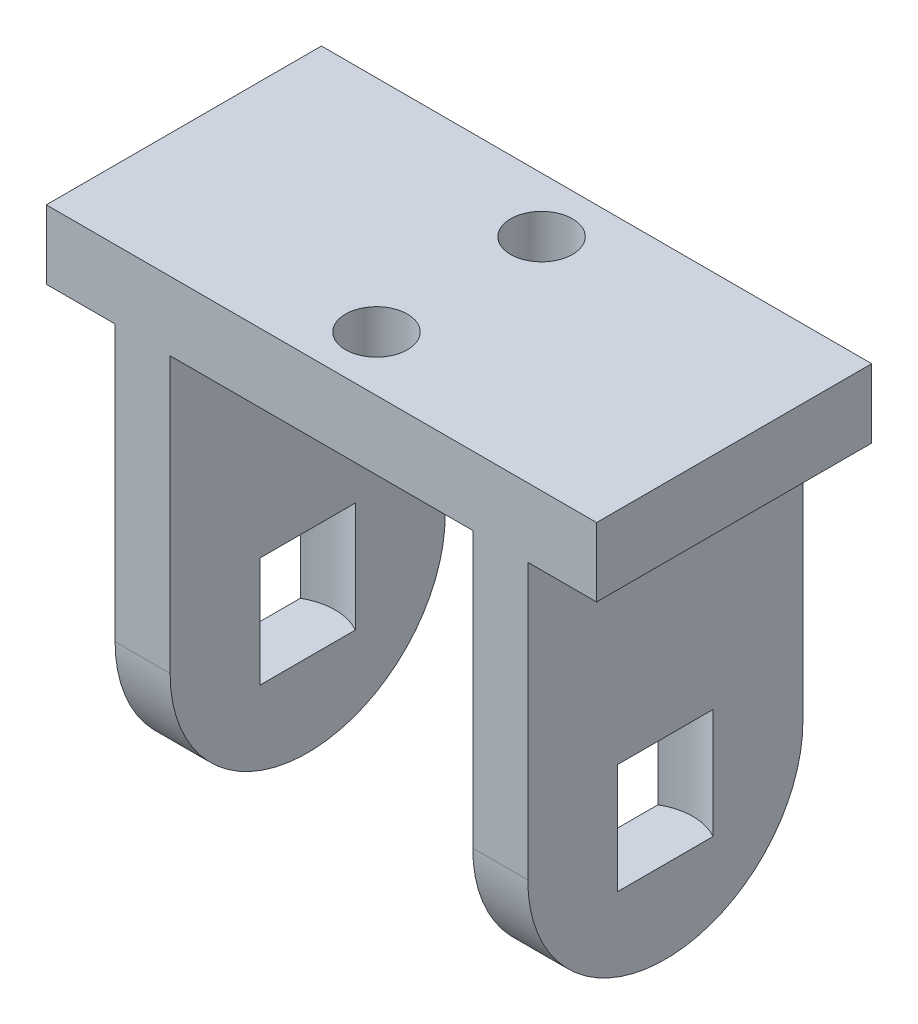
ISO-10303-21;
HEADER;
FILE_DESCRIPTION(('STEP AP214'),'2;1');
FILE_NAME('part.step','',(''),(''),'','','');
FILE_SCHEMA(('AUTOMOTIVE_DESIGN { 1 0 10303 214 1 1 1 1 }'));
ENDSEC;
DATA;
#1=APPLICATION_CONTEXT('core data for automotive mechanical design processes');
#2=APPLICATION_PROTOCOL_DEFINITION('international standard','automotive_design',2000,#1);
#3=PRODUCT_CONTEXT('',#1,'mechanical');
#4=PRODUCT('Part','Part','',(#3));
#5=PRODUCT_RELATED_PRODUCT_CATEGORY('part','',(#4));
#6=PRODUCT_DEFINITION_FORMATION('','',#4);
#7=PRODUCT_DEFINITION_CONTEXT('part definition',#1,'design');
#8=PRODUCT_DEFINITION('design','',#6,#7);
#9=PRODUCT_DEFINITION_SHAPE('','',#8);
#10=(LENGTH_UNIT() NAMED_UNIT(*) SI_UNIT(.MILLI.,.METRE.));
#11=(NAMED_UNIT(*) PLANE_ANGLE_UNIT() SI_UNIT($,.RADIAN.));
#12=(NAMED_UNIT(*) SI_UNIT($,.STERADIAN.) SOLID_ANGLE_UNIT());
#13=UNCERTAINTY_MEASURE_WITH_UNIT(LENGTH_MEASURE(1.E-05),#10,'distance_accuracy_value','');
#14=(GEOMETRIC_REPRESENTATION_CONTEXT(3) GLOBAL_UNCERTAINTY_ASSIGNED_CONTEXT((#13)) GLOBAL_UNIT_ASSIGNED_CONTEXT((#10,
#11,#12)) REPRESENTATION_CONTEXT('',''));
#15=CARTESIAN_POINT('',(0.,0.,0.));
#16=DIRECTION('',(0.,0.,1.));
#17=DIRECTION('',(1.,0.,0.));
#18=AXIS2_PLACEMENT_3D('',#15,#16,#17);
#19=CARTESIAN_POINT('',(-22.,30.,0.));
#20=DIRECTION('',(-1.,0.,0.));
#21=DIRECTION('',(0.,0.,1.));
#22=AXIS2_PLACEMENT_3D('',#19,#20,#21);
#23=PLANE('',#22);
#24=DIRECTION('',(0.,0.,1.));
#25=VECTOR('',#24,1.);
#26=CARTESIAN_POINT('',(-22.,70.,20.));
#27=LINE('',#26,#25);
#28=CARTESIAN_POINT('',(-22.,70.,-20.));
#29=VERTEX_POINT('',#28);
#30=CARTESIAN_POINT('',(-22.,70.,20.));
#31=VERTEX_POINT('',#30);
#32=EDGE_CURVE('E271',#29,#31,#27,.T.);
#33=ORIENTED_EDGE('',*,*,#32,.T.);
#34=DIRECTION('',(0.,-1.,0.));
#35=VECTOR('',#34,1.);
#36=CARTESIAN_POINT('',(-22.,30.,20.));
#37=LINE('',#36,#35);
#38=CARTESIAN_POINT('',(-22.,30.,20.));
#39=VERTEX_POINT('',#38);
#40=EDGE_CURVE('E275',#31,#39,#37,.T.);
#41=ORIENTED_EDGE('',*,*,#40,.T.);
#42=CARTESIAN_POINT('',(-22.,30.,0.));
#43=DIRECTION('',(1.,0.,0.));
#44=DIRECTION('',(0.,0.,1.));
#45=AXIS2_PLACEMENT_3D('',#42,#43,#44);
#46=CIRCLE('',#45,20.);
#47=CARTESIAN_POINT('',(-22.,30.,-20.));
#48=VERTEX_POINT('',#47);
#49=EDGE_CURVE('E279',#39,#48,#46,.T.);
#50=ORIENTED_EDGE('',*,*,#49,.T.);
#51=DIRECTION('',(0.,1.,0.));
#52=VECTOR('',#51,1.);
#53=CARTESIAN_POINT('',(-22.,70.,-20.));
#54=LINE('',#53,#52);
#55=EDGE_CURVE('E282',#48,#29,#54,.T.);
#56=ORIENTED_EDGE('',*,*,#55,.T.);
#57=EDGE_LOOP('',(#33,#41,#50,#56));
#58=FACE_BOUND('',#57,.T.);
#59=DIRECTION('',(0.,0.,-1.));
#60=VECTOR('',#59,1.);
#61=CARTESIAN_POINT('',(-22.,22.,0.));
#62=LINE('',#61,#60);
#63=CARTESIAN_POINT('',(-22.,22.,6.92820323027551));
#64=VERTEX_POINT('',#63);
#65=CARTESIAN_POINT('',(-22.,22.,-6.92820323027551));
#66=VERTEX_POINT('',#65);
#67=EDGE_CURVE('E219',#64,#66,#62,.T.);
#68=ORIENTED_EDGE('',*,*,#67,.F.);
#69=DIRECTION('',(0.,1.,0.));
#70=VECTOR('',#69,1.);
#71=CARTESIAN_POINT('',(-22.,22.,6.92820323027551));
#72=LINE('',#71,#70);
#73=CARTESIAN_POINT('',(-22.,38.,6.92820323027551));
#74=VERTEX_POINT('',#73);
#75=EDGE_CURVE('E231',#64,#74,#72,.T.);
#76=ORIENTED_EDGE('',*,*,#75,.T.);
#77=DIRECTION('',(0.,0.,-1.));
#78=VECTOR('',#77,1.);
#79=CARTESIAN_POINT('',(-22.,38.,0.));
#80=LINE('',#79,#78);
#81=CARTESIAN_POINT('',(-22.,38.,-6.92820323027551));
#82=VERTEX_POINT('',#81);
#83=EDGE_CURVE('E212',#74,#82,#80,.T.);
#84=ORIENTED_EDGE('',*,*,#83,.T.);
#85=DIRECTION('',(0.,1.,0.));
#86=VECTOR('',#85,1.);
#87=CARTESIAN_POINT('',(-22.,22.,-6.92820323027551));
#88=LINE('',#87,#86);
#89=EDGE_CURVE('E227',#82,#66,#88,.F.);
#90=ORIENTED_EDGE('',*,*,#89,.T.);
#91=EDGE_LOOP('',(#68,#76,#84,#90));
#92=FACE_BOUND('',#91,.T.);
#93=ADVANCED_FACE('F45',(#58,#92),#23,.F.);
#94=CARTESIAN_POINT('',(-30.,30.,0.));
#95=DIRECTION('',(-1.,0.,0.));
#96=DIRECTION('',(0.,0.,1.));
#97=AXIS2_PLACEMENT_3D('',#94,#95,#96);
#98=PLANE('',#97);
#99=DIRECTION('',(0.,0.,1.));
#100=VECTOR('',#99,1.);
#101=CARTESIAN_POINT('',(-30.,70.,20.));
#102=LINE('',#101,#100);
#103=CARTESIAN_POINT('',(-30.,70.,-20.));
#104=VERTEX_POINT('',#103);
#105=CARTESIAN_POINT('',(-30.,70.,20.));
#106=VERTEX_POINT('',#105);
#107=EDGE_CURVE('E270',#104,#106,#102,.T.);
#108=ORIENTED_EDGE('',*,*,#107,.F.);
#109=DIRECTION('',(0.,1.,0.));
#110=VECTOR('',#109,1.);
#111=CARTESIAN_POINT('',(-30.,70.,-20.));
#112=LINE('',#111,#110);
#113=CARTESIAN_POINT('',(-30.,30.,-20.));
#114=VERTEX_POINT('',#113);
#115=EDGE_CURVE('E276',#114,#104,#112,.T.);
#116=ORIENTED_EDGE('',*,*,#115,.F.);
#117=CARTESIAN_POINT('',(-30.,30.,0.));
#118=DIRECTION('',(1.,0.,0.));
#119=DIRECTION('',(0.,0.,1.));
#120=AXIS2_PLACEMENT_3D('',#117,#118,#119);
#121=CIRCLE('',#120,20.);
#122=CARTESIAN_POINT('',(-30.,30.,20.));
#123=VERTEX_POINT('',#122);
#124=EDGE_CURVE('E292',#123,#114,#121,.T.);
#125=ORIENTED_EDGE('',*,*,#124,.F.);
#126=DIRECTION('',(0.,-1.,0.));
#127=VECTOR('',#126,1.);
#128=CARTESIAN_POINT('',(-30.,30.,20.));
#129=LINE('',#128,#127);
#130=EDGE_CURVE('E289',#106,#123,#129,.T.);
#131=ORIENTED_EDGE('',*,*,#130,.F.);
#132=EDGE_LOOP('',(#108,#116,#125,#131));
#133=FACE_BOUND('',#132,.T.);
#134=DIRECTION('',(0.,1.,0.));
#135=VECTOR('',#134,1.);
#136=CARTESIAN_POINT('',(-30.,22.,6.92820323027551));
#137=LINE('',#136,#135);
#138=CARTESIAN_POINT('',(-30.,22.,6.92820323027551));
#139=VERTEX_POINT('',#138);
#140=CARTESIAN_POINT('',(-30.,38.,6.92820323027551));
#141=VERTEX_POINT('',#140);
#142=EDGE_CURVE('E55',#139,#141,#137,.T.);
#143=ORIENTED_EDGE('',*,*,#142,.F.);
#144=DIRECTION('',(0.,0.,-1.));
#145=VECTOR('',#144,1.);
#146=CARTESIAN_POINT('',(-30.,22.,0.));
#147=LINE('',#146,#145);
#148=CARTESIAN_POINT('',(-30.,22.,-6.92820323027551));
#149=VERTEX_POINT('',#148);
#150=EDGE_CURVE('E11',#139,#149,#147,.T.);
#151=ORIENTED_EDGE('',*,*,#150,.T.);
#152=DIRECTION('',(0.,1.,0.));
#153=VECTOR('',#152,1.);
#154=CARTESIAN_POINT('',(-30.,22.,-6.92820323027551));
#155=LINE('',#154,#153);
#156=CARTESIAN_POINT('',(-30.,38.,-6.92820323027551));
#157=VERTEX_POINT('',#156);
#158=EDGE_CURVE('E368',#157,#149,#155,.F.);
#159=ORIENTED_EDGE('',*,*,#158,.F.);
#160=DIRECTION('',(0.,0.,-1.));
#161=VECTOR('',#160,1.);
#162=CARTESIAN_POINT('',(-30.,38.,0.));
#163=LINE('',#162,#161);
#164=EDGE_CURVE('E365',#141,#157,#163,.T.);
#165=ORIENTED_EDGE('',*,*,#164,.F.);
#166=EDGE_LOOP('',(#143,#151,#159,#165));
#167=FACE_BOUND('',#166,.T.);
#168=ADVANCED_FACE('F466',(#133,#167),#98,.T.);
#169=CARTESIAN_POINT('',(30.,30.,0.));
#170=DIRECTION('',(-1.,0.,0.));
#171=DIRECTION('',(0.,0.,1.));
#172=AXIS2_PLACEMENT_3D('',#169,#170,#171);
#173=PLANE('',#172);
#174=DIRECTION('',(0.,0.,1.));
#175=VECTOR('',#174,1.);
#176=CARTESIAN_POINT('',(30.,70.,20.));
#177=LINE('',#176,#175);
#178=CARTESIAN_POINT('',(30.,70.,-20.));
#179=VERTEX_POINT('',#178);
#180=CARTESIAN_POINT('',(30.,70.,20.));
#181=VERTEX_POINT('',#180);
#182=EDGE_CURVE('E236',#179,#181,#177,.T.);
#183=ORIENTED_EDGE('',*,*,#182,.T.);
#184=DIRECTION('',(0.,-1.,0.));
#185=VECTOR('',#184,1.);
#186=CARTESIAN_POINT('',(30.,30.,20.));
#187=LINE('',#186,#185);
#188=CARTESIAN_POINT('',(30.,30.,20.));
#189=VERTEX_POINT('',#188);
#190=EDGE_CURVE('E240',#181,#189,#187,.T.);
#191=ORIENTED_EDGE('',*,*,#190,.T.);
#192=CARTESIAN_POINT('',(30.,30.,0.));
#193=DIRECTION('',(1.,0.,0.));
#194=DIRECTION('',(0.,0.,1.));
#195=AXIS2_PLACEMENT_3D('',#192,#193,#194);
#196=CIRCLE('',#195,20.);
#197=CARTESIAN_POINT('',(30.,30.,-20.));
#198=VERTEX_POINT('',#197);
#199=EDGE_CURVE('E244',#189,#198,#196,.T.);
#200=ORIENTED_EDGE('',*,*,#199,.T.);
#201=DIRECTION('',(0.,1.,0.));
#202=VECTOR('',#201,1.);
#203=CARTESIAN_POINT('',(30.,70.,-20.));
#204=LINE('',#203,#202);
#205=EDGE_CURVE('E247',#198,#179,#204,.T.);
#206=ORIENTED_EDGE('',*,*,#205,.T.);
#207=EDGE_LOOP('',(#183,#191,#200,#206));
#208=FACE_BOUND('',#207,.T.);
#209=DIRECTION('',(0.,0.,-1.));
#210=VECTOR('',#209,1.);
#211=CARTESIAN_POINT('',(30.,22.,0.));
#212=LINE('',#211,#210);
#213=CARTESIAN_POINT('',(30.,22.,6.92820323027551));
#214=VERTEX_POINT('',#213);
#215=CARTESIAN_POINT('',(30.,22.,-6.92820323027551));
#216=VERTEX_POINT('',#215);
#217=EDGE_CURVE('E195',#214,#216,#212,.T.);
#218=ORIENTED_EDGE('',*,*,#217,.F.);
#219=DIRECTION('',(0.,1.,0.));
#220=VECTOR('',#219,1.);
#221=CARTESIAN_POINT('',(30.,22.,6.92820323027551));
#222=LINE('',#221,#220);
#223=CARTESIAN_POINT('',(30.,38.,6.92820323027551));
#224=VERTEX_POINT('',#223);
#225=EDGE_CURVE('E201',#214,#224,#222,.T.);
#226=ORIENTED_EDGE('',*,*,#225,.T.);
#227=DIRECTION('',(0.,0.,-1.));
#228=VECTOR('',#227,1.);
#229=CARTESIAN_POINT('',(30.,38.,0.));
#230=LINE('',#229,#228);
#231=CARTESIAN_POINT('',(30.,38.,-6.92820323027551));
#232=VERTEX_POINT('',#231);
#233=EDGE_CURVE('E183',#224,#232,#230,.T.);
#234=ORIENTED_EDGE('',*,*,#233,.T.);
#235=DIRECTION('',(0.,1.,0.));
#236=VECTOR('',#235,1.);
#237=CARTESIAN_POINT('',(30.,22.,-6.92820323027551));
#238=LINE('',#237,#236);
#239=EDGE_CURVE('E213',#232,#216,#238,.F.);
#240=ORIENTED_EDGE('',*,*,#239,.T.);
#241=EDGE_LOOP('',(#218,#226,#234,#240));
#242=FACE_BOUND('',#241,.T.);
#243=ADVANCED_FACE('F210',(#208,#242),#173,.F.);
#244=CARTESIAN_POINT('',(22.,30.,0.));
#245=DIRECTION('',(-1.,0.,0.));
#246=DIRECTION('',(0.,0.,1.));
#247=AXIS2_PLACEMENT_3D('',#244,#245,#246);
#248=PLANE('',#247);
#249=DIRECTION('',(0.,0.,1.));
#250=VECTOR('',#249,1.);
#251=CARTESIAN_POINT('',(22.,70.,20.));
#252=LINE('',#251,#250);
#253=CARTESIAN_POINT('',(22.,70.,-20.));
#254=VERTEX_POINT('',#253);
#255=CARTESIAN_POINT('',(22.,70.,20.));
#256=VERTEX_POINT('',#255);
#257=EDGE_CURVE('E235',#254,#256,#252,.T.);
#258=ORIENTED_EDGE('',*,*,#257,.F.);
#259=DIRECTION('',(0.,1.,0.));
#260=VECTOR('',#259,1.);
#261=CARTESIAN_POINT('',(22.,70.,-20.));
#262=LINE('',#261,#260);
#263=CARTESIAN_POINT('',(22.,30.,-20.));
#264=VERTEX_POINT('',#263);
#265=EDGE_CURVE('E241',#264,#254,#262,.T.);
#266=ORIENTED_EDGE('',*,*,#265,.F.);
#267=CARTESIAN_POINT('',(22.,30.,0.));
#268=DIRECTION('',(1.,0.,0.));
#269=DIRECTION('',(0.,0.,1.));
#270=AXIS2_PLACEMENT_3D('',#267,#268,#269);
#271=CIRCLE('',#270,20.);
#272=CARTESIAN_POINT('',(22.,30.,20.));
#273=VERTEX_POINT('',#272);
#274=EDGE_CURVE('E257',#273,#264,#271,.T.);
#275=ORIENTED_EDGE('',*,*,#274,.F.);
#276=DIRECTION('',(0.,-1.,0.));
#277=VECTOR('',#276,1.);
#278=CARTESIAN_POINT('',(22.,30.,20.));
#279=LINE('',#278,#277);
#280=EDGE_CURVE('E254',#256,#273,#279,.T.);
#281=ORIENTED_EDGE('',*,*,#280,.F.);
#282=EDGE_LOOP('',(#258,#266,#275,#281));
#283=FACE_BOUND('',#282,.T.);
#284=DIRECTION('',(0.,1.,0.));
#285=VECTOR('',#284,1.);
#286=CARTESIAN_POINT('',(22.,22.,6.92820323027551));
#287=LINE('',#286,#285);
#288=CARTESIAN_POINT('',(22.,22.,6.92820323027551));
#289=VERTEX_POINT('',#288);
#290=CARTESIAN_POINT('',(22.,38.,6.92820323027551));
#291=VERTEX_POINT('',#290);
#292=EDGE_CURVE('E204',#289,#291,#287,.T.);
#293=ORIENTED_EDGE('',*,*,#292,.F.);
#294=DIRECTION('',(0.,0.,-1.));
#295=VECTOR('',#294,1.);
#296=CARTESIAN_POINT('',(22.,22.,0.));
#297=LINE('',#296,#295);
#298=CARTESIAN_POINT('',(22.,22.,-6.92820323027551));
#299=VERTEX_POINT('',#298);
#300=EDGE_CURVE('E361',#289,#299,#297,.T.);
#301=ORIENTED_EDGE('',*,*,#300,.T.);
#302=DIRECTION('',(0.,1.,0.));
#303=VECTOR('',#302,1.);
#304=CARTESIAN_POINT('',(22.,22.,-6.92820323027551));
#305=LINE('',#304,#303);
#306=CARTESIAN_POINT('',(22.,38.,-6.92820323027551));
#307=VERTEX_POINT('',#306);
#308=EDGE_CURVE('E356',#307,#299,#305,.F.);
#309=ORIENTED_EDGE('',*,*,#308,.F.);
#310=DIRECTION('',(0.,0.,-1.));
#311=VECTOR('',#310,1.);
#312=CARTESIAN_POINT('',(22.,38.,0.));
#313=LINE('',#312,#311);
#314=EDGE_CURVE('E353',#291,#307,#313,.T.);
#315=ORIENTED_EDGE('',*,*,#314,.F.);
#316=EDGE_LOOP('',(#293,#301,#309,#315));
#317=FACE_BOUND('',#316,.T.);
#318=ADVANCED_FACE('F450',(#283,#317),#248,.T.);
#319=CARTESIAN_POINT('',(0.,70.,0.));
#320=DIRECTION('',(0.,-1.,0.));
#321=DIRECTION('',(0.,0.,-1.));
#322=AXIS2_PLACEMENT_3D('',#319,#320,#321);
#323=PLANE('',#322);
#324=DIRECTION('',(1.,0.,0.));
#325=VECTOR('',#324,1.);
#326=CARTESIAN_POINT('',(40.,70.,20.));
#327=LINE('',#326,#325);
#328=CARTESIAN_POINT('',(40.,70.,20.));
#329=VERTEX_POINT('',#328);
#330=EDGE_CURVE('E324',#181,#329,#327,.T.);
#331=ORIENTED_EDGE('',*,*,#330,.F.);
#332=ORIENTED_EDGE('',*,*,#182,.F.);
#333=DIRECTION('',(-1.,0.,0.));
#334=VECTOR('',#333,1.);
#335=CARTESIAN_POINT('',(-40.,70.,-20.));
#336=LINE('',#335,#334);
#337=CARTESIAN_POINT('',(40.,70.,-20.));
#338=VERTEX_POINT('',#337);
#339=EDGE_CURVE('E311',#338,#179,#336,.T.);
#340=ORIENTED_EDGE('',*,*,#339,.F.);
#341=DIRECTION('',(0.,0.,-1.));
#342=VECTOR('',#341,1.);
#343=CARTESIAN_POINT('',(40.,70.,-20.));
#344=LINE('',#343,#342);
#345=EDGE_CURVE('E329',#329,#338,#344,.T.);
#346=ORIENTED_EDGE('',*,*,#345,.F.);
#347=EDGE_LOOP('',(#331,#332,#340,#346));
#348=FACE_BOUND('',#347,.T.);
#349=ADVANCED_FACE('F439',(#348),#323,.T.);
#350=CARTESIAN_POINT('',(-40.,70.,-20.));
#351=VERTEX_POINT('',#350);
#352=EDGE_CURVE('E333',#104,#351,#336,.T.);
#353=ORIENTED_EDGE('',*,*,#352,.F.);
#354=ORIENTED_EDGE('',*,*,#107,.T.);
#355=CARTESIAN_POINT('',(-40.,70.,20.));
#356=VERTEX_POINT('',#355);
#357=EDGE_CURVE('E325',#356,#106,#327,.T.);
#358=ORIENTED_EDGE('',*,*,#357,.F.);
#359=DIRECTION('',(0.,0.,1.));
#360=VECTOR('',#359,1.);
#361=CARTESIAN_POINT('',(-40.,70.,20.));
#362=LINE('',#361,#360);
#363=EDGE_CURVE('E305',#351,#356,#362,.T.);
#364=ORIENTED_EDGE('',*,*,#363,.F.);
#365=EDGE_LOOP('',(#353,#354,#358,#364));
#366=FACE_BOUND('',#365,.T.);
#367=ADVANCED_FACE('F425',(#366),#323,.T.);
#368=CARTESIAN_POINT('',(-40.,80.,20.));
#369=DIRECTION('',(1.,0.,0.));
#370=DIRECTION('',(0.,0.,-1.));
#371=AXIS2_PLACEMENT_3D('',#368,#369,#370);
#372=PLANE('',#371);
#373=ORIENTED_EDGE('',*,*,#363,.T.);
#374=DIRECTION('',(0.,-1.,0.));
#375=VECTOR('',#374,1.);
#376=CARTESIAN_POINT('',(-40.,80.,20.));
#377=LINE('',#376,#375);
#378=CARTESIAN_POINT('',(-40.,80.,20.));
#379=VERTEX_POINT('',#378);
#380=EDGE_CURVE('E349',#379,#356,#377,.T.);
#381=ORIENTED_EDGE('',*,*,#380,.F.);
#382=DIRECTION('',(0.,0.,1.));
#383=VECTOR('',#382,1.);
#384=CARTESIAN_POINT('',(-40.,80.,20.));
#385=LINE('',#384,#383);
#386=CARTESIAN_POINT('',(-40.,80.,-20.));
#387=VERTEX_POINT('',#386);
#388=EDGE_CURVE('E306',#387,#379,#385,.T.);
#389=ORIENTED_EDGE('',*,*,#388,.F.);
#390=DIRECTION('',(0.,-1.,0.));
#391=VECTOR('',#390,1.);
#392=CARTESIAN_POINT('',(-40.,80.,-20.));
#393=LINE('',#392,#391);
#394=EDGE_CURVE('E320',#387,#351,#393,.T.);
#395=ORIENTED_EDGE('',*,*,#394,.T.);
#396=EDGE_LOOP('',(#373,#381,#389,#395));
#397=FACE_BOUND('',#396,.T.);
#398=ADVANCED_FACE('F47',(#397),#372,.F.);
#399=CARTESIAN_POINT('',(40.,80.,20.));
#400=DIRECTION('',(0.,0.,-1.));
#401=DIRECTION('',(-1.,0.,0.));
#402=AXIS2_PLACEMENT_3D('',#399,#400,#401);
#403=PLANE('',#402);
#404=ORIENTED_EDGE('',*,*,#357,.T.);
#405=ORIENTED_EDGE('',*,*,#130,.T.);
#406=DIRECTION('',(-1.,0.,0.));
#407=VECTOR('',#406,1.);
#408=CARTESIAN_POINT('',(-22.,30.,20.));
#409=LINE('',#408,#407);
#410=EDGE_CURVE('E301',#39,#123,#409,.T.);
#411=ORIENTED_EDGE('',*,*,#410,.F.);
#412=ORIENTED_EDGE('',*,*,#40,.F.);
#413=EDGE_CURVE('E330',#31,#256,#327,.T.);
#414=ORIENTED_EDGE('',*,*,#413,.T.);
#415=ORIENTED_EDGE('',*,*,#280,.T.);
#416=DIRECTION('',(-1.,0.,0.));
#417=VECTOR('',#416,1.);
#418=CARTESIAN_POINT('',(30.,30.,20.));
#419=LINE('',#418,#417);
#420=EDGE_CURVE('E266',#189,#273,#419,.T.);
#421=ORIENTED_EDGE('',*,*,#420,.F.);
#422=ORIENTED_EDGE('',*,*,#190,.F.);
#423=ORIENTED_EDGE('',*,*,#330,.T.);
#424=DIRECTION('',(0.,-1.,0.));
#425=VECTOR('',#424,1.);
#426=CARTESIAN_POINT('',(40.,80.,20.));
#427=LINE('',#426,#425);
#428=CARTESIAN_POINT('',(40.,80.,20.));
#429=VERTEX_POINT('',#428);
#430=EDGE_CURVE('E345',#429,#329,#427,.T.);
#431=ORIENTED_EDGE('',*,*,#430,.F.);
#432=DIRECTION('',(1.,0.,0.));
#433=VECTOR('',#432,1.);
#434=CARTESIAN_POINT('',(40.,80.,20.));
#435=LINE('',#434,#433);
#436=EDGE_CURVE('E310',#379,#429,#435,.T.);
#437=ORIENTED_EDGE('',*,*,#436,.F.);
#438=ORIENTED_EDGE('',*,*,#380,.T.);
#439=EDGE_LOOP('',(#404,#405,#411,#412,#414,#415,#421,#422,#423,#431,#437,#438));
#440=FACE_BOUND('',#439,.T.);
#441=ADVANCED_FACE('F428',(#440),#403,.F.);
#442=CARTESIAN_POINT('',(40.,80.,-20.));
#443=DIRECTION('',(-1.,0.,0.));
#444=DIRECTION('',(0.,0.,1.));
#445=AXIS2_PLACEMENT_3D('',#442,#443,#444);
#446=PLANE('',#445);
#447=ORIENTED_EDGE('',*,*,#345,.T.);
#448=DIRECTION('',(0.,-1.,0.));
#449=VECTOR('',#448,1.);
#450=CARTESIAN_POINT('',(40.,80.,-20.));
#451=LINE('',#450,#449);
#452=CARTESIAN_POINT('',(40.,80.,-20.));
#453=VERTEX_POINT('',#452);
#454=EDGE_CURVE('E341',#453,#338,#451,.T.);
#455=ORIENTED_EDGE('',*,*,#454,.F.);
#456=DIRECTION('',(0.,0.,-1.));
#457=VECTOR('',#456,1.);
#458=CARTESIAN_POINT('',(40.,80.,-20.));
#459=LINE('',#458,#457);
#460=EDGE_CURVE('E314',#429,#453,#459,.T.);
#461=ORIENTED_EDGE('',*,*,#460,.F.);
#462=ORIENTED_EDGE('',*,*,#430,.T.);
#463=EDGE_LOOP('',(#447,#455,#461,#462));
#464=FACE_BOUND('',#463,.T.);
#465=ADVANCED_FACE('F458',(#464),#446,.F.);
#466=CARTESIAN_POINT('',(-40.,80.,-20.));
#467=DIRECTION('',(0.,0.,1.));
#468=DIRECTION('',(1.,0.,0.));
#469=AXIS2_PLACEMENT_3D('',#466,#467,#468);
#470=PLANE('',#469);
#471=ORIENTED_EDGE('',*,*,#339,.T.);
#472=ORIENTED_EDGE('',*,*,#205,.F.);
#473=DIRECTION('',(-1.,0.,0.));
#474=VECTOR('',#473,1.);
#475=CARTESIAN_POINT('',(30.,30.,-20.));
#476=LINE('',#475,#474);
#477=EDGE_CURVE('E251',#198,#264,#476,.T.);
#478=ORIENTED_EDGE('',*,*,#477,.T.);
#479=ORIENTED_EDGE('',*,*,#265,.T.);
#480=EDGE_CURVE('E337',#254,#29,#336,.T.);
#481=ORIENTED_EDGE('',*,*,#480,.T.);
#482=ORIENTED_EDGE('',*,*,#55,.F.);
#483=DIRECTION('',(-1.,0.,0.));
#484=VECTOR('',#483,1.);
#485=CARTESIAN_POINT('',(-22.,30.,-20.));
#486=LINE('',#485,#484);
#487=EDGE_CURVE('E286',#48,#114,#486,.T.);
#488=ORIENTED_EDGE('',*,*,#487,.T.);
#489=ORIENTED_EDGE('',*,*,#115,.T.);
#490=ORIENTED_EDGE('',*,*,#352,.T.);
#491=ORIENTED_EDGE('',*,*,#394,.F.);
#492=DIRECTION('',(-1.,0.,0.));
#493=VECTOR('',#492,1.);
#494=CARTESIAN_POINT('',(-40.,80.,-20.));
#495=LINE('',#494,#493);
#496=EDGE_CURVE('E317',#453,#387,#495,.T.);
#497=ORIENTED_EDGE('',*,*,#496,.F.);
#498=ORIENTED_EDGE('',*,*,#454,.T.);
#499=EDGE_LOOP('',(#471,#472,#478,#479,#481,#482,#488,#489,#490,#491,#497,#498));
#500=FACE_BOUND('',#499,.T.);
#501=ADVANCED_FACE('F416',(#500),#470,.F.);
#502=CARTESIAN_POINT('',(0.,80.,0.));
#503=DIRECTION('',(0.,-1.,0.));
#504=DIRECTION('',(0.,0.,-1.));
#505=AXIS2_PLACEMENT_3D('',#502,#503,#504);
#506=PLANE('',#505);
#507=CARTESIAN_POINT('',(0.,80.,-12.));
#508=DIRECTION('',(0.,1.,0.));
#509=DIRECTION('',(0.,0.,1.));
#510=AXIS2_PLACEMENT_3D('',#507,#508,#509);
#511=CIRCLE('',#510,4.5);
#512=CARTESIAN_POINT('',(0.,80.,-7.5));
#513=VERTEX_POINT('',#512);
#514=EDGE_CURVE('E375',#513,#513,#511,.T.);
#515=ORIENTED_EDGE('',*,*,#514,.F.);
#516=EDGE_LOOP('',(#515));
#517=FACE_BOUND('',#516,.T.);
#518=CARTESIAN_POINT('',(0.,80.,12.));
#519=DIRECTION('',(0.,1.,0.));
#520=DIRECTION('',(0.,0.,1.));
#521=AXIS2_PLACEMENT_3D('',#518,#519,#520);
#522=CIRCLE('',#521,4.5);
#523=CARTESIAN_POINT('',(0.,80.,16.5));
#524=VERTEX_POINT('',#523);
#525=EDGE_CURVE('E384',#524,#524,#522,.T.);
#526=ORIENTED_EDGE('',*,*,#525,.F.);
#527=EDGE_LOOP('',(#526));
#528=FACE_BOUND('',#527,.T.);
#529=ORIENTED_EDGE('',*,*,#388,.T.);
#530=ORIENTED_EDGE('',*,*,#436,.T.);
#531=ORIENTED_EDGE('',*,*,#460,.T.);
#532=ORIENTED_EDGE('',*,*,#496,.T.);
#533=EDGE_LOOP('',(#529,#530,#531,#532));
#534=FACE_BOUND('',#533,.T.);
#535=ADVANCED_FACE('F432',(#517,#528,#534),#506,.F.);
#536=CARTESIAN_POINT('',(0.,70.,-12.));
#537=DIRECTION('',(0.,-1.,0.));
#538=DIRECTION('',(0.,0.,-1.));
#539=AXIS2_PLACEMENT_3D('',#536,#537,#538);
#540=CIRCLE('',#539,4.5);
#541=CARTESIAN_POINT('',(0.,70.,-16.5));
#542=VERTEX_POINT('',#541);
#543=EDGE_CURVE('E49',#542,#542,#540,.T.);
#544=ORIENTED_EDGE('',*,*,#543,.F.);
#545=EDGE_LOOP('',(#544));
#546=FACE_BOUND('',#545,.T.);
#547=CARTESIAN_POINT('',(0.,70.,12.));
#548=DIRECTION('',(0.,-1.,0.));
#549=DIRECTION('',(0.,0.,-1.));
#550=AXIS2_PLACEMENT_3D('',#547,#548,#549);
#551=CIRCLE('',#550,4.5);
#552=CARTESIAN_POINT('',(0.,70.,7.5));
#553=VERTEX_POINT('',#552);
#554=EDGE_CURVE('E372',#553,#553,#551,.T.);
#555=ORIENTED_EDGE('',*,*,#554,.F.);
#556=EDGE_LOOP('',(#555));
#557=FACE_BOUND('',#556,.T.);
#558=ORIENTED_EDGE('',*,*,#257,.T.);
#559=ORIENTED_EDGE('',*,*,#413,.F.);
#560=ORIENTED_EDGE('',*,*,#32,.F.);
#561=ORIENTED_EDGE('',*,*,#480,.F.);
#562=EDGE_LOOP('',(#558,#559,#560,#561));
#563=FACE_BOUND('',#562,.T.);
#564=ADVANCED_FACE('F455',(#546,#557,#563),#323,.T.);
#565=CARTESIAN_POINT('',(-22.,30.,0.));
#566=DIRECTION('',(-1.,0.,0.));
#567=DIRECTION('',(0.,0.,1.));
#568=AXIS2_PLACEMENT_3D('',#565,#566,#567);
#569=CYLINDRICAL_SURFACE('',#568,20.);
#570=ORIENTED_EDGE('',*,*,#124,.T.);
#571=ORIENTED_EDGE('',*,*,#487,.F.);
#572=ORIENTED_EDGE('',*,*,#49,.F.);
#573=ORIENTED_EDGE('',*,*,#410,.T.);
#574=EDGE_LOOP('',(#570,#571,#572,#573));
#575=FACE_BOUND('',#574,.T.);
#576=ADVANCED_FACE('F478',(#575),#569,.T.);
#577=CARTESIAN_POINT('',(30.,30.,0.));
#578=DIRECTION('',(-1.,0.,0.));
#579=DIRECTION('',(0.,0.,1.));
#580=AXIS2_PLACEMENT_3D('',#577,#578,#579);
#581=CYLINDRICAL_SURFACE('',#580,20.);
#582=ORIENTED_EDGE('',*,*,#274,.T.);
#583=ORIENTED_EDGE('',*,*,#477,.F.);
#584=ORIENTED_EDGE('',*,*,#199,.F.);
#585=ORIENTED_EDGE('',*,*,#420,.T.);
#586=EDGE_LOOP('',(#582,#583,#584,#585));
#587=FACE_BOUND('',#586,.T.);
#588=ADVANCED_FACE('F475',(#587),#581,.T.);
#589=CARTESIAN_POINT('',(26.,22.,0.));
#590=DIRECTION('',(0.,1.,0.));
#591=DIRECTION('',(0.,0.,1.));
#592=AXIS2_PLACEMENT_3D('',#589,#590,#591);
#593=CYLINDRICAL_SURFACE('',#592,8.);
#594=CARTESIAN_POINT('',(26.,22.,0.));
#595=DIRECTION('',(0.,1.,0.));
#596=DIRECTION('',(0.,0.,1.));
#597=AXIS2_PLACEMENT_3D('',#594,#595,#596);
#598=CIRCLE('',#597,8.);
#599=EDGE_CURVE('E381',#289,#214,#598,.T.);
#600=ORIENTED_EDGE('',*,*,#599,.F.);
#601=ORIENTED_EDGE('',*,*,#292,.T.);
#602=CARTESIAN_POINT('',(26.,38.,0.));
#603=DIRECTION('',(0.,1.,0.));
#604=DIRECTION('',(0.,0.,1.));
#605=AXIS2_PLACEMENT_3D('',#602,#603,#604);
#606=CIRCLE('',#605,8.);
#607=EDGE_CURVE('E186',#291,#224,#606,.T.);
#608=ORIENTED_EDGE('',*,*,#607,.T.);
#609=ORIENTED_EDGE('',*,*,#225,.F.);
#610=EDGE_LOOP('',(#600,#601,#608,#609));
#611=FACE_BOUND('',#610,.T.);
#612=ADVANCED_FACE('F200',(#611),#593,.F.);
#613=EDGE_CURVE('E189',#232,#307,#606,.T.);
#614=ORIENTED_EDGE('',*,*,#613,.T.);
#615=ORIENTED_EDGE('',*,*,#308,.T.);
#616=EDGE_CURVE('E207',#216,#299,#598,.T.);
#617=ORIENTED_EDGE('',*,*,#616,.F.);
#618=ORIENTED_EDGE('',*,*,#239,.F.);
#619=EDGE_LOOP('',(#614,#615,#617,#618));
#620=FACE_BOUND('',#619,.T.);
#621=ADVANCED_FACE('F406',(#620),#593,.F.);
#622=CARTESIAN_POINT('',(26.,22.,0.));
#623=DIRECTION('',(0.,1.,0.));
#624=DIRECTION('',(0.,0.,1.));
#625=AXIS2_PLACEMENT_3D('',#622,#623,#624);
#626=PLANE('',#625);
#627=ORIENTED_EDGE('',*,*,#217,.T.);
#628=ORIENTED_EDGE('',*,*,#616,.T.);
#629=ORIENTED_EDGE('',*,*,#300,.F.);
#630=ORIENTED_EDGE('',*,*,#599,.T.);
#631=EDGE_LOOP('',(#627,#628,#629,#630));
#632=FACE_BOUND('',#631,.T.);
#633=ADVANCED_FACE('F404',(#632),#626,.T.);
#634=CARTESIAN_POINT('',(26.,38.,0.));
#635=DIRECTION('',(0.,1.,0.));
#636=DIRECTION('',(0.,0.,1.));
#637=AXIS2_PLACEMENT_3D('',#634,#635,#636);
#638=PLANE('',#637);
#639=ORIENTED_EDGE('',*,*,#607,.F.);
#640=ORIENTED_EDGE('',*,*,#314,.T.);
#641=ORIENTED_EDGE('',*,*,#613,.F.);
#642=ORIENTED_EDGE('',*,*,#233,.F.);
#643=EDGE_LOOP('',(#639,#640,#641,#642));
#644=FACE_BOUND('',#643,.T.);
#645=ADVANCED_FACE('F185',(#644),#638,.F.);
#646=CARTESIAN_POINT('',(-26.,22.,0.));
#647=DIRECTION('',(0.,1.,0.));
#648=DIRECTION('',(0.,0.,1.));
#649=AXIS2_PLACEMENT_3D('',#646,#647,#648);
#650=CYLINDRICAL_SURFACE('',#649,8.);
#651=CARTESIAN_POINT('',(-26.,22.,0.));
#652=DIRECTION('',(0.,1.,0.));
#653=DIRECTION('',(0.,0.,1.));
#654=AXIS2_PLACEMENT_3D('',#651,#652,#653);
#655=CIRCLE('',#654,8.);
#656=EDGE_CURVE('E392',#139,#64,#655,.T.);
#657=ORIENTED_EDGE('',*,*,#656,.F.);
#658=ORIENTED_EDGE('',*,*,#142,.T.);
#659=CARTESIAN_POINT('',(-26.,38.,0.));
#660=DIRECTION('',(0.,1.,0.));
#661=DIRECTION('',(0.,0.,1.));
#662=AXIS2_PLACEMENT_3D('',#659,#660,#661);
#663=CIRCLE('',#662,8.);
#664=EDGE_CURVE('E68',#141,#74,#663,.T.);
#665=ORIENTED_EDGE('',*,*,#664,.T.);
#666=ORIENTED_EDGE('',*,*,#75,.F.);
#667=EDGE_LOOP('',(#657,#658,#665,#666));
#668=FACE_BOUND('',#667,.T.);
#669=ADVANCED_FACE('F570',(#668),#650,.F.);
#670=EDGE_CURVE('E63',#82,#157,#663,.T.);
#671=ORIENTED_EDGE('',*,*,#670,.T.);
#672=ORIENTED_EDGE('',*,*,#158,.T.);
#673=EDGE_CURVE('E196',#66,#149,#655,.T.);
#674=ORIENTED_EDGE('',*,*,#673,.F.);
#675=ORIENTED_EDGE('',*,*,#89,.F.);
#676=EDGE_LOOP('',(#671,#672,#674,#675));
#677=FACE_BOUND('',#676,.T.);
#678=ADVANCED_FACE('F579',(#677),#650,.F.);
#679=CARTESIAN_POINT('',(-26.,22.,0.));
#680=DIRECTION('',(0.,1.,0.));
#681=DIRECTION('',(0.,0.,1.));
#682=AXIS2_PLACEMENT_3D('',#679,#680,#681);
#683=PLANE('',#682);
#684=ORIENTED_EDGE('',*,*,#67,.T.);
#685=ORIENTED_EDGE('',*,*,#673,.T.);
#686=ORIENTED_EDGE('',*,*,#150,.F.);
#687=ORIENTED_EDGE('',*,*,#656,.T.);
#688=EDGE_LOOP('',(#684,#685,#686,#687));
#689=FACE_BOUND('',#688,.T.);
#690=ADVANCED_FACE('F589',(#689),#683,.T.);
#691=CARTESIAN_POINT('',(-26.,38.,0.));
#692=DIRECTION('',(0.,1.,0.));
#693=DIRECTION('',(0.,0.,1.));
#694=AXIS2_PLACEMENT_3D('',#691,#692,#693);
#695=PLANE('',#694);
#696=ORIENTED_EDGE('',*,*,#664,.F.);
#697=ORIENTED_EDGE('',*,*,#164,.T.);
#698=ORIENTED_EDGE('',*,*,#670,.F.);
#699=ORIENTED_EDGE('',*,*,#83,.F.);
#700=EDGE_LOOP('',(#696,#697,#698,#699));
#701=FACE_BOUND('',#700,.T.);
#702=ADVANCED_FACE('F598',(#701),#695,.F.);
#703=CARTESIAN_POINT('',(0.,10.,12.));
#704=DIRECTION('',(0.,1.,0.));
#705=DIRECTION('',(0.,0.,1.));
#706=AXIS2_PLACEMENT_3D('',#703,#704,#705);
#707=CYLINDRICAL_SURFACE('',#706,4.5);
#708=ORIENTED_EDGE('',*,*,#554,.T.);
#709=EDGE_LOOP('',(#708));
#710=FACE_BOUND('',#709,.T.);
#711=ORIENTED_EDGE('',*,*,#525,.T.);
#712=EDGE_LOOP('',(#711));
#713=FACE_BOUND('',#712,.T.);
#714=ADVANCED_FACE('F608',(#710,#713),#707,.F.);
#715=CARTESIAN_POINT('',(0.,10.,-12.));
#716=DIRECTION('',(0.,1.,0.));
#717=DIRECTION('',(0.,0.,1.));
#718=AXIS2_PLACEMENT_3D('',#715,#716,#717);
#719=CYLINDRICAL_SURFACE('',#718,4.5);
#720=ORIENTED_EDGE('',*,*,#543,.T.);
#721=EDGE_LOOP('',(#720));
#722=FACE_BOUND('',#721,.T.);
#723=ORIENTED_EDGE('',*,*,#514,.T.);
#724=EDGE_LOOP('',(#723));
#725=FACE_BOUND('',#724,.T.);
#726=ADVANCED_FACE('F630',(#722,#725),#719,.F.);
#727=CLOSED_SHELL('',(#93,#168,#243,#318,#349,#367,#398,#441,#465,#501,#535,#564,#576,#588,#612,
#621,#633,#645,#669,#678,#690,#702,#714,#726));
#728=MANIFOLD_SOLID_BREP('B2',#727);
#729=ADVANCED_BREP_SHAPE_REPRESENTATION('',(#18,#728),#14);
#730=SHAPE_DEFINITION_REPRESENTATION(#9,#729);
ENDSEC;
END-ISO-10303-21;
